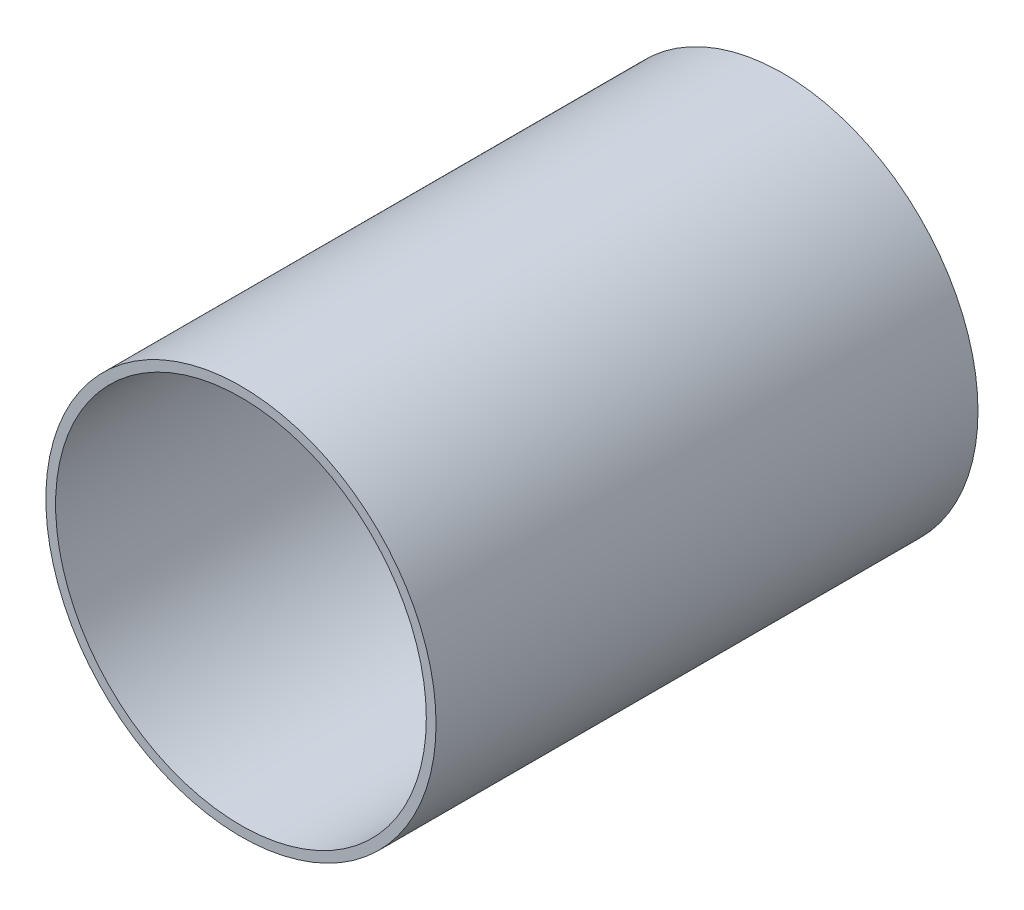
ISO-10303-21;
HEADER;
FILE_DESCRIPTION(('STEP AP214'),'2;1');
FILE_NAME('part.step','',(''),(''),'','','');
FILE_SCHEMA(('AUTOMOTIVE_DESIGN { 1 0 10303 214 1 1 1 1 }'));
ENDSEC;
DATA;
#1=APPLICATION_CONTEXT('core data for automotive mechanical design processes');
#2=APPLICATION_PROTOCOL_DEFINITION('international standard','automotive_design',2000,#1);
#3=PRODUCT_CONTEXT('',#1,'mechanical');
#4=PRODUCT('Part','Part','',(#3));
#5=PRODUCT_RELATED_PRODUCT_CATEGORY('part','',(#4));
#6=PRODUCT_DEFINITION_FORMATION('','',#4);
#7=PRODUCT_DEFINITION_CONTEXT('part definition',#1,'design');
#8=PRODUCT_DEFINITION('design','',#6,#7);
#9=PRODUCT_DEFINITION_SHAPE('','',#8);
#10=(LENGTH_UNIT() NAMED_UNIT(*) SI_UNIT(.MILLI.,.METRE.));
#11=(NAMED_UNIT(*) PLANE_ANGLE_UNIT() SI_UNIT($,.RADIAN.));
#12=(NAMED_UNIT(*) SI_UNIT($,.STERADIAN.) SOLID_ANGLE_UNIT());
#13=UNCERTAINTY_MEASURE_WITH_UNIT(LENGTH_MEASURE(1.E-05),#10,'distance_accuracy_value','');
#14=(GEOMETRIC_REPRESENTATION_CONTEXT(3) GLOBAL_UNCERTAINTY_ASSIGNED_CONTEXT((#13)) GLOBAL_UNIT_ASSIGNED_CONTEXT((#10,
#11,#12)) REPRESENTATION_CONTEXT('',''));
#15=CARTESIAN_POINT('',(0.,0.,0.));
#16=DIRECTION('',(0.,0.,1.));
#17=DIRECTION('',(1.,0.,0.));
#18=AXIS2_PLACEMENT_3D('',#15,#16,#17);
#19=CARTESIAN_POINT('',(0.,0.,150.));
#20=DIRECTION('',(0.,0.,1.));
#21=DIRECTION('',(1.,0.,0.));
#22=AXIS2_PLACEMENT_3D('',#19,#20,#21);
#23=PLANE('',#22);
#24=CARTESIAN_POINT('',(0.,0.,150.));
#25=DIRECTION('',(0.,0.,1.));
#26=DIRECTION('',(1.,0.,0.));
#27=AXIS2_PLACEMENT_3D('',#24,#25,#26);
#28=CIRCLE('',#27,54.);
#29=CARTESIAN_POINT('',(54.,0.,150.));
#30=VERTEX_POINT('',#29);
#31=EDGE_CURVE('E10',#30,#30,#28,.T.);
#32=ORIENTED_EDGE('',*,*,#31,.T.);
#33=EDGE_LOOP('',(#32));
#34=FACE_BOUND('',#33,.T.);
#35=CARTESIAN_POINT('',(0.,0.,150.));
#36=DIRECTION('',(0.,0.,1.));
#37=DIRECTION('',(1.,0.,0.));
#38=AXIS2_PLACEMENT_3D('',#35,#36,#37);
#39=CIRCLE('',#38,51.304);
#40=CARTESIAN_POINT('',(51.304,0.,150.));
#41=VERTEX_POINT('',#40);
#42=EDGE_CURVE('E58',#41,#41,#39,.T.);
#43=ORIENTED_EDGE('',*,*,#42,.F.);
#44=EDGE_LOOP('',(#43));
#45=FACE_BOUND('',#44,.T.);
#46=ADVANCED_FACE('F45',(#34,#45),#23,.T.);
#47=CARTESIAN_POINT('',(0.,0.,0.));
#48=DIRECTION('',(0.,0.,1.));
#49=DIRECTION('',(1.,0.,0.));
#50=AXIS2_PLACEMENT_3D('',#47,#48,#49);
#51=PLANE('',#50);
#52=CARTESIAN_POINT('',(0.,0.,0.));
#53=DIRECTION('',(0.,0.,1.));
#54=DIRECTION('',(1.,0.,0.));
#55=AXIS2_PLACEMENT_3D('',#52,#53,#54);
#56=CIRCLE('',#55,54.);
#57=CARTESIAN_POINT('',(54.,0.,0.));
#58=VERTEX_POINT('',#57);
#59=EDGE_CURVE('E49',#58,#58,#56,.T.);
#60=ORIENTED_EDGE('',*,*,#59,.F.);
#61=EDGE_LOOP('',(#60));
#62=FACE_BOUND('',#61,.T.);
#63=CARTESIAN_POINT('',(0.,0.,0.));
#64=DIRECTION('',(0.,0.,1.));
#65=DIRECTION('',(1.,0.,0.));
#66=AXIS2_PLACEMENT_3D('',#63,#64,#65);
#67=CIRCLE('',#66,51.304);
#68=CARTESIAN_POINT('',(51.304,0.,0.));
#69=VERTEX_POINT('',#68);
#70=EDGE_CURVE('E60',#69,#69,#67,.T.);
#71=ORIENTED_EDGE('',*,*,#70,.T.);
#72=EDGE_LOOP('',(#71));
#73=FACE_BOUND('',#72,.T.);
#74=ADVANCED_FACE('F72',(#62,#73),#51,.F.);
#75=CARTESIAN_POINT('',(0.,0.,150.));
#76=DIRECTION('',(0.,0.,-1.));
#77=DIRECTION('',(-1.,0.,0.));
#78=AXIS2_PLACEMENT_3D('',#75,#76,#77);
#79=CYLINDRICAL_SURFACE('',#78,54.);
#80=ORIENTED_EDGE('',*,*,#31,.F.);
#81=EDGE_LOOP('',(#80));
#82=FACE_BOUND('',#81,.T.);
#83=ORIENTED_EDGE('',*,*,#59,.T.);
#84=EDGE_LOOP('',(#83));
#85=FACE_BOUND('',#84,.T.);
#86=ADVANCED_FACE('F47',(#82,#85),#79,.T.);
#87=CARTESIAN_POINT('',(0.,0.,150.));
#88=DIRECTION('',(0.,0.,-1.));
#89=DIRECTION('',(-1.,0.,0.));
#90=AXIS2_PLACEMENT_3D('',#87,#88,#89);
#91=CYLINDRICAL_SURFACE('',#90,51.304);
#92=ORIENTED_EDGE('',*,*,#42,.T.);
#93=EDGE_LOOP('',(#92));
#94=FACE_BOUND('',#93,.T.);
#95=ORIENTED_EDGE('',*,*,#70,.F.);
#96=EDGE_LOOP('',(#95));
#97=FACE_BOUND('',#96,.T.);
#98=ADVANCED_FACE('F68',(#94,#97),#91,.F.);
#99=CLOSED_SHELL('',(#46,#74,#86,#98));
#100=MANIFOLD_SOLID_BREP('B2',#99);
#101=ADVANCED_BREP_SHAPE_REPRESENTATION('',(#18,#100),#14);
#102=SHAPE_DEFINITION_REPRESENTATION(#9,#101);
ENDSEC;
END-ISO-10303-21;
